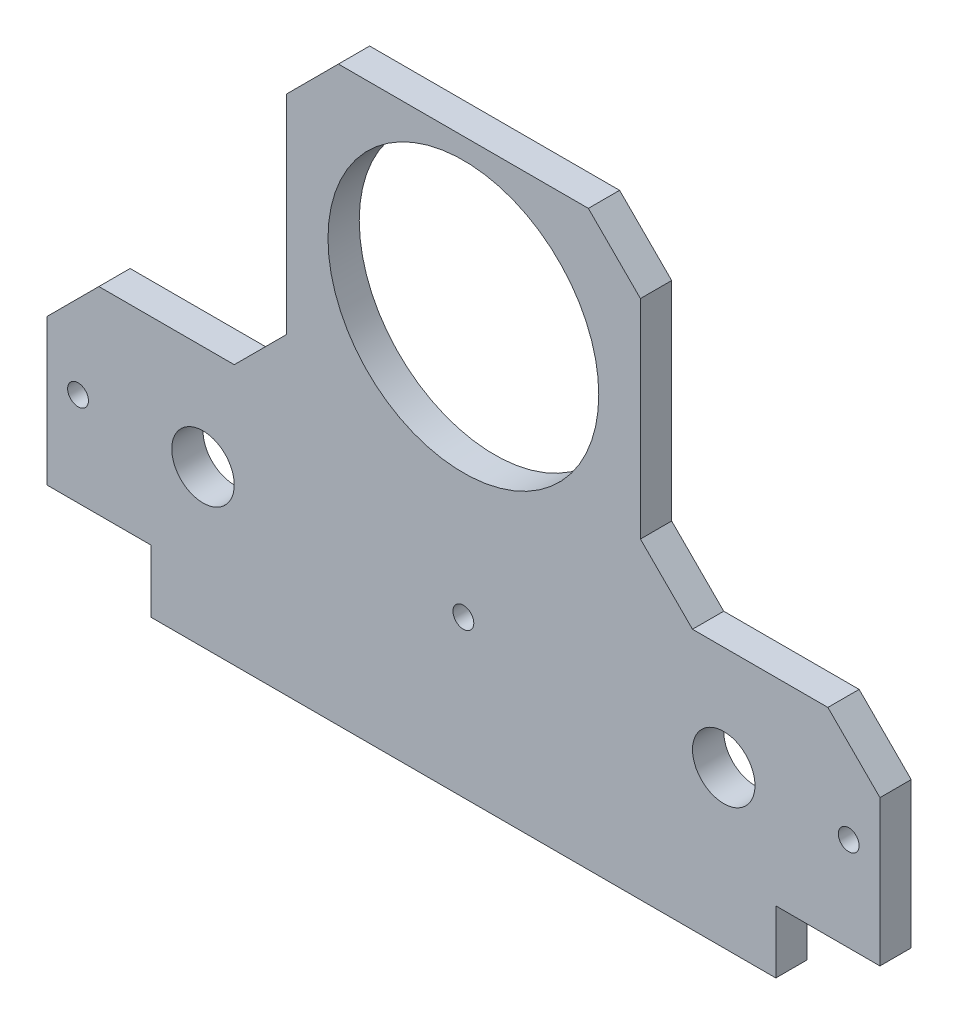
ISO-10303-21;
HEADER;
FILE_DESCRIPTION(('STEP AP214'),'2;1');
FILE_NAME('part.step','',(''),(''),'','','');
FILE_SCHEMA(('AUTOMOTIVE_DESIGN { 1 0 10303 214 1 1 1 1 }'));
ENDSEC;
DATA;
#1=APPLICATION_CONTEXT('core data for automotive mechanical design processes');
#2=APPLICATION_PROTOCOL_DEFINITION('international standard','automotive_design',2000,#1);
#3=PRODUCT_CONTEXT('',#1,'mechanical');
#4=PRODUCT('Part','Part','',(#3));
#5=PRODUCT_RELATED_PRODUCT_CATEGORY('part','',(#4));
#6=PRODUCT_DEFINITION_FORMATION('','',#4);
#7=PRODUCT_DEFINITION_CONTEXT('part definition',#1,'design');
#8=PRODUCT_DEFINITION('design','',#6,#7);
#9=PRODUCT_DEFINITION_SHAPE('','',#8);
#10=(LENGTH_UNIT() NAMED_UNIT(*) SI_UNIT(.MILLI.,.METRE.));
#11=(NAMED_UNIT(*) PLANE_ANGLE_UNIT() SI_UNIT($,.RADIAN.));
#12=(NAMED_UNIT(*) SI_UNIT($,.STERADIAN.) SOLID_ANGLE_UNIT());
#13=UNCERTAINTY_MEASURE_WITH_UNIT(LENGTH_MEASURE(1.E-05),#10,'distance_accuracy_value','');
#14=(GEOMETRIC_REPRESENTATION_CONTEXT(3) GLOBAL_UNCERTAINTY_ASSIGNED_CONTEXT((#13)) GLOBAL_UNIT_ASSIGNED_CONTEXT((#10,
#11,#12)) REPRESENTATION_CONTEXT('',''));
#15=CARTESIAN_POINT('',(0.,0.,0.));
#16=DIRECTION('',(0.,0.,1.));
#17=DIRECTION('',(1.,0.,0.));
#18=AXIS2_PLACEMENT_3D('',#15,#16,#17);
#19=CARTESIAN_POINT('',(0.,0.,12.));
#20=DIRECTION('',(0.,0.,1.));
#21=DIRECTION('',(1.,0.,0.));
#22=AXIS2_PLACEMENT_3D('',#19,#20,#21);
#23=PLANE('',#22);
#24=CARTESIAN_POINT('',(0.,15.,12.));
#25=DIRECTION('',(0.,0.,-1.));
#26=DIRECTION('',(-1.,0.,0.));
#27=AXIS2_PLACEMENT_3D('',#24,#25,#26);
#28=CIRCLE('',#27,1.);
#29=CARTESIAN_POINT('',(-1.,15.,12.));
#30=VERTEX_POINT('',#29);
#31=EDGE_CURVE('E272',#30,#30,#28,.T.);
#32=ORIENTED_EDGE('',*,*,#31,.T.);
#33=EDGE_LOOP('',(#32));
#34=FACE_BOUND('',#33,.T.);
#35=CARTESIAN_POINT('',(-37.,15.,12.));
#36=DIRECTION('',(0.,0.,-1.));
#37=DIRECTION('',(1.,0.,0.));
#38=AXIS2_PLACEMENT_3D('',#35,#36,#37);
#39=CIRCLE('',#38,0.999999999999998);
#40=CARTESIAN_POINT('',(-36.,15.,12.));
#41=VERTEX_POINT('',#40);
#42=EDGE_CURVE('E275',#41,#41,#39,.T.);
#43=ORIENTED_EDGE('',*,*,#42,.T.);
#44=EDGE_LOOP('',(#43));
#45=FACE_BOUND('',#44,.T.);
#46=CARTESIAN_POINT('',(37.,15.,12.));
#47=DIRECTION('',(0.,0.,-1.));
#48=DIRECTION('',(-1.,0.,0.));
#49=AXIS2_PLACEMENT_3D('',#46,#47,#48);
#50=CIRCLE('',#49,0.999999999999998);
#51=CARTESIAN_POINT('',(36.,15.,12.));
#52=VERTEX_POINT('',#51);
#53=EDGE_CURVE('E278',#52,#52,#50,.T.);
#54=ORIENTED_EDGE('',*,*,#53,.T.);
#55=EDGE_LOOP('',(#54));
#56=FACE_BOUND('',#55,.T.);
#57=DIRECTION('',(0.,1.,0.));
#58=VECTOR('',#57,1.);
#59=CARTESIAN_POINT('',(17.,25.,12.));
#60=LINE('',#59,#58);
#61=CARTESIAN_POINT('',(17.,30.,12.));
#62=VERTEX_POINT('',#61);
#63=CARTESIAN_POINT('',(17.,50.,12.));
#64=VERTEX_POINT('',#63);
#65=EDGE_CURVE('E189',#62,#64,#60,.T.);
#66=ORIENTED_EDGE('',*,*,#65,.T.);
#67=DIRECTION('',(0.707106781186547,-0.707106781186549,0.));
#68=VECTOR('',#67,1.);
#69=CARTESIAN_POINT('',(33.5,33.4999999999999,12.));
#70=LINE('',#69,#68);
#71=CARTESIAN_POINT('',(12.,55.,12.));
#72=VERTEX_POINT('',#71);
#73=EDGE_CURVE('E201',#64,#72,#70,.F.);
#74=ORIENTED_EDGE('',*,*,#73,.T.);
#75=DIRECTION('',(-1.,0.,0.));
#76=VECTOR('',#75,1.);
#77=CARTESIAN_POINT('',(17.,55.,12.));
#78=LINE('',#77,#76);
#79=CARTESIAN_POINT('',(-12.,55.,12.));
#80=VERTEX_POINT('',#79);
#81=EDGE_CURVE('E185',#72,#80,#78,.T.);
#82=ORIENTED_EDGE('',*,*,#81,.T.);
#83=DIRECTION('',(0.707106781186548,0.707106781186548,0.));
#84=VECTOR('',#83,1.);
#85=CARTESIAN_POINT('',(-33.5,33.5,12.));
#86=LINE('',#85,#84);
#87=CARTESIAN_POINT('',(-17.,50.,12.));
#88=VERTEX_POINT('',#87);
#89=EDGE_CURVE('E184',#80,#88,#86,.F.);
#90=ORIENTED_EDGE('',*,*,#89,.T.);
#91=DIRECTION('',(0.,-1.,0.));
#92=VECTOR('',#91,1.);
#93=CARTESIAN_POINT('',(-17.,25.,12.));
#94=LINE('',#93,#92);
#95=CARTESIAN_POINT('',(-17.,30.,12.));
#96=VERTEX_POINT('',#95);
#97=EDGE_CURVE('E314',#88,#96,#94,.T.);
#98=ORIENTED_EDGE('',*,*,#97,.T.);
#99=DIRECTION('',(0.707106781186551,0.707106781186544,0.));
#100=VECTOR('',#99,1.);
#101=CARTESIAN_POINT('',(-22.,25.,12.));
#102=LINE('',#101,#100);
#103=CARTESIAN_POINT('',(-22.,25.,12.));
#104=VERTEX_POINT('',#103);
#105=EDGE_CURVE('E11',#96,#104,#102,.F.);
#106=ORIENTED_EDGE('',*,*,#105,.T.);
#107=DIRECTION('',(-1.,0.,0.));
#108=VECTOR('',#107,1.);
#109=CARTESIAN_POINT('',(-40.,25.,12.));
#110=LINE('',#109,#108);
#111=CARTESIAN_POINT('',(-35.,25.,12.));
#112=VERTEX_POINT('',#111);
#113=EDGE_CURVE('E317',#104,#112,#110,.T.);
#114=ORIENTED_EDGE('',*,*,#113,.T.);
#115=DIRECTION('',(0.707106781186549,0.707106781186546,0.));
#116=VECTOR('',#115,1.);
#117=CARTESIAN_POINT('',(-29.9999999999999,30.0000000000001,12.));
#118=LINE('',#117,#116);
#119=CARTESIAN_POINT('',(-40.,20.,12.));
#120=VERTEX_POINT('',#119);
#121=EDGE_CURVE('E57',#112,#120,#118,.F.);
#122=ORIENTED_EDGE('',*,*,#121,.T.);
#123=DIRECTION('',(0.,-1.,0.));
#124=VECTOR('',#123,1.);
#125=CARTESIAN_POINT('',(-40.,0.,12.));
#126=LINE('',#125,#124);
#127=CARTESIAN_POINT('',(-40.,6.,12.));
#128=VERTEX_POINT('',#127);
#129=EDGE_CURVE('E319',#120,#128,#126,.T.);
#130=ORIENTED_EDGE('',*,*,#129,.T.);
#131=DIRECTION('',(-1.,0.,0.));
#132=VECTOR('',#131,1.);
#133=CARTESIAN_POINT('',(-40.,6.,12.));
#134=LINE('',#133,#132);
#135=CARTESIAN_POINT('',(-30.,6.,12.));
#136=VERTEX_POINT('',#135);
#137=EDGE_CURVE('E296',#136,#128,#134,.T.);
#138=ORIENTED_EDGE('',*,*,#137,.F.);
#139=DIRECTION('',(0.,1.,0.));
#140=VECTOR('',#139,1.);
#141=CARTESIAN_POINT('',(-30.,0.,12.));
#142=LINE('',#141,#140);
#143=CARTESIAN_POINT('',(-30.,0.,12.));
#144=VERTEX_POINT('',#143);
#145=EDGE_CURVE('E290',#144,#136,#142,.T.);
#146=ORIENTED_EDGE('',*,*,#145,.F.);
#147=DIRECTION('',(1.,0.,0.));
#148=VECTOR('',#147,1.);
#149=CARTESIAN_POINT('',(-40.,0.,12.));
#150=LINE('',#149,#148);
#151=CARTESIAN_POINT('',(30.,0.,12.));
#152=VERTEX_POINT('',#151);
#153=EDGE_CURVE('E321',#144,#152,#150,.T.);
#154=ORIENTED_EDGE('',*,*,#153,.T.);
#155=DIRECTION('',(0.,-1.,0.));
#156=VECTOR('',#155,1.);
#157=CARTESIAN_POINT('',(30.,0.,12.));
#158=LINE('',#157,#156);
#159=CARTESIAN_POINT('',(30.,6.,12.));
#160=VERTEX_POINT('',#159);
#161=EDGE_CURVE('E284',#160,#152,#158,.T.);
#162=ORIENTED_EDGE('',*,*,#161,.F.);
#163=DIRECTION('',(-1.,0.,0.));
#164=VECTOR('',#163,1.);
#165=CARTESIAN_POINT('',(40.,6.,12.));
#166=LINE('',#165,#164);
#167=CARTESIAN_POINT('',(40.,6.,12.));
#168=VERTEX_POINT('',#167);
#169=EDGE_CURVE('E281',#168,#160,#166,.T.);
#170=ORIENTED_EDGE('',*,*,#169,.F.);
#171=DIRECTION('',(0.,1.,0.));
#172=VECTOR('',#171,1.);
#173=CARTESIAN_POINT('',(40.,0.,12.));
#174=LINE('',#173,#172);
#175=CARTESIAN_POINT('',(40.,20.,12.));
#176=VERTEX_POINT('',#175);
#177=EDGE_CURVE('E324',#168,#176,#174,.T.);
#178=ORIENTED_EDGE('',*,*,#177,.T.);
#179=DIRECTION('',(0.707106781186546,-0.70710678118655,0.));
#180=VECTOR('',#179,1.);
#181=CARTESIAN_POINT('',(30.0000000000001,29.9999999999999,12.));
#182=LINE('',#181,#180);
#183=CARTESIAN_POINT('',(35.,25.,12.));
#184=VERTEX_POINT('',#183);
#185=EDGE_CURVE('E198',#176,#184,#182,.F.);
#186=ORIENTED_EDGE('',*,*,#185,.T.);
#187=DIRECTION('',(-1.,0.,0.));
#188=VECTOR('',#187,1.);
#189=CARTESIAN_POINT('',(40.,25.,12.));
#190=LINE('',#189,#188);
#191=CARTESIAN_POINT('',(22.,25.,12.));
#192=VERTEX_POINT('',#191);
#193=EDGE_CURVE('E229',#184,#192,#190,.T.);
#194=ORIENTED_EDGE('',*,*,#193,.T.);
#195=DIRECTION('',(0.707106781186544,-0.707106781186551,0.));
#196=VECTOR('',#195,1.);
#197=CARTESIAN_POINT('',(17.,30.,12.));
#198=LINE('',#197,#196);
#199=EDGE_CURVE('E42',#192,#62,#198,.F.);
#200=ORIENTED_EDGE('',*,*,#199,.T.);
#201=EDGE_LOOP('',(#66,#74,#82,#90,#98,#106,#114,#122,#130,#138,#146,#154,#162,#170,#178,#186,
#194,#200));
#202=FACE_BOUND('',#201,.T.);
#203=CARTESIAN_POINT('',(-25.,15.,12.));
#204=DIRECTION('',(0.,0.,-1.));
#205=DIRECTION('',(1.,0.,0.));
#206=AXIS2_PLACEMENT_3D('',#203,#204,#205);
#207=CIRCLE('',#206,3.);
#208=CARTESIAN_POINT('',(-22.,15.,12.));
#209=VERTEX_POINT('',#208);
#210=EDGE_CURVE('E302',#209,#209,#207,.T.);
#211=ORIENTED_EDGE('',*,*,#210,.T.);
#212=EDGE_LOOP('',(#211));
#213=FACE_BOUND('',#212,.T.);
#214=CARTESIAN_POINT('',(25.,15.,12.));
#215=DIRECTION('',(0.,0.,-1.));
#216=DIRECTION('',(-1.,0.,0.));
#217=AXIS2_PLACEMENT_3D('',#214,#215,#216);
#218=CIRCLE('',#217,3.);
#219=CARTESIAN_POINT('',(22.,15.,12.));
#220=VERTEX_POINT('',#219);
#221=EDGE_CURVE('E308',#220,#220,#218,.T.);
#222=ORIENTED_EDGE('',*,*,#221,.T.);
#223=EDGE_LOOP('',(#222));
#224=FACE_BOUND('',#223,.T.);
#225=CARTESIAN_POINT('',(0.,40.,12.));
#226=DIRECTION('',(0.,0.,1.));
#227=DIRECTION('',(1.,0.,0.));
#228=AXIS2_PLACEMENT_3D('',#225,#226,#227);
#229=CIRCLE('',#228,13.);
#230=CARTESIAN_POINT('',(13.,40.,12.));
#231=VERTEX_POINT('',#230);
#232=EDGE_CURVE('E311',#231,#231,#229,.T.);
#233=ORIENTED_EDGE('',*,*,#232,.F.);
#234=EDGE_LOOP('',(#233));
#235=FACE_BOUND('',#234,.T.);
#236=ADVANCED_FACE('F33',(#34,#45,#56,#202,#213,#224,#235),#23,.T.);
#237=CARTESIAN_POINT('',(-17.,25.,12.));
#238=DIRECTION('',(1.,0.,0.));
#239=DIRECTION('',(0.,1.,0.));
#240=AXIS2_PLACEMENT_3D('',#237,#238,#239);
#241=PLANE('',#240);
#242=DIRECTION('',(0.,0.,-1.));
#243=VECTOR('',#242,1.);
#244=CARTESIAN_POINT('',(-17.,50.,12.));
#245=LINE('',#244,#243);
#246=CARTESIAN_POINT('',(-17.,50.,9.));
#247=VERTEX_POINT('',#246);
#248=EDGE_CURVE('E205',#88,#247,#245,.T.);
#249=ORIENTED_EDGE('',*,*,#248,.T.);
#250=DIRECTION('',(0.,-1.,0.));
#251=VECTOR('',#250,1.);
#252=CARTESIAN_POINT('',(-17.,25.,9.));
#253=LINE('',#252,#251);
#254=CARTESIAN_POINT('',(-17.,30.,9.));
#255=VERTEX_POINT('',#254);
#256=EDGE_CURVE('E165',#247,#255,#253,.T.);
#257=ORIENTED_EDGE('',*,*,#256,.T.);
#258=DIRECTION('',(0.,0.,1.));
#259=VECTOR('',#258,1.);
#260=CARTESIAN_POINT('',(-17.,30.,12.));
#261=LINE('',#260,#259);
#262=EDGE_CURVE('E203',#255,#96,#261,.T.);
#263=ORIENTED_EDGE('',*,*,#262,.T.);
#264=ORIENTED_EDGE('',*,*,#97,.F.);
#265=EDGE_LOOP('',(#249,#257,#263,#264));
#266=FACE_BOUND('',#265,.T.);
#267=ADVANCED_FACE('F363',(#266),#241,.F.);
#268=CARTESIAN_POINT('',(-40.,25.,12.));
#269=DIRECTION('',(0.,-1.,0.));
#270=DIRECTION('',(1.,0.,0.));
#271=AXIS2_PLACEMENT_3D('',#268,#269,#270);
#272=PLANE('',#271);
#273=DIRECTION('',(0.,0.,-1.));
#274=VECTOR('',#273,1.);
#275=CARTESIAN_POINT('',(-22.,25.,0.));
#276=LINE('',#275,#274);
#277=CARTESIAN_POINT('',(-22.,25.,9.));
#278=VERTEX_POINT('',#277);
#279=EDGE_CURVE('E216',#104,#278,#276,.T.);
#280=ORIENTED_EDGE('',*,*,#279,.T.);
#281=DIRECTION('',(-1.,0.,0.));
#282=VECTOR('',#281,1.);
#283=CARTESIAN_POINT('',(-40.,25.,9.));
#284=LINE('',#283,#282);
#285=CARTESIAN_POINT('',(-35.,25.,9.));
#286=VERTEX_POINT('',#285);
#287=EDGE_CURVE('E356',#278,#286,#284,.T.);
#288=ORIENTED_EDGE('',*,*,#287,.T.);
#289=DIRECTION('',(0.,0.,1.));
#290=VECTOR('',#289,1.);
#291=CARTESIAN_POINT('',(-35.,25.,12.));
#292=LINE('',#291,#290);
#293=EDGE_CURVE('E214',#286,#112,#292,.T.);
#294=ORIENTED_EDGE('',*,*,#293,.T.);
#295=ORIENTED_EDGE('',*,*,#113,.F.);
#296=EDGE_LOOP('',(#280,#288,#294,#295));
#297=FACE_BOUND('',#296,.T.);
#298=ADVANCED_FACE('F371',(#297),#272,.F.);
#299=CARTESIAN_POINT('',(-40.,0.,12.));
#300=DIRECTION('',(1.,0.,0.));
#301=DIRECTION('',(0.,0.,-1.));
#302=AXIS2_PLACEMENT_3D('',#299,#300,#301);
#303=PLANE('',#302);
#304=DIRECTION('',(0.,0.,-1.));
#305=VECTOR('',#304,1.);
#306=CARTESIAN_POINT('',(-40.,20.,12.));
#307=LINE('',#306,#305);
#308=CARTESIAN_POINT('',(-40.,20.,9.));
#309=VERTEX_POINT('',#308);
#310=EDGE_CURVE('E219',#120,#309,#307,.T.);
#311=ORIENTED_EDGE('',*,*,#310,.T.);
#312=DIRECTION('',(0.,1.,0.));
#313=VECTOR('',#312,1.);
#314=CARTESIAN_POINT('',(-40.,0.,9.));
#315=LINE('',#314,#313);
#316=CARTESIAN_POINT('',(-40.,6.,9.));
#317=VERTEX_POINT('',#316);
#318=EDGE_CURVE('E49',#317,#309,#315,.T.);
#319=ORIENTED_EDGE('',*,*,#318,.F.);
#320=DIRECTION('',(0.,0.,1.));
#321=VECTOR('',#320,1.);
#322=CARTESIAN_POINT('',(-40.,6.,0.));
#323=LINE('',#322,#321);
#324=EDGE_CURVE('E300',#317,#128,#323,.T.);
#325=ORIENTED_EDGE('',*,*,#324,.T.);
#326=ORIENTED_EDGE('',*,*,#129,.F.);
#327=EDGE_LOOP('',(#311,#319,#325,#326));
#328=FACE_BOUND('',#327,.T.);
#329=ADVANCED_FACE('F376',(#328),#303,.F.);
#330=CARTESIAN_POINT('',(-40.,0.,12.));
#331=DIRECTION('',(0.,1.,0.));
#332=DIRECTION('',(0.,0.,1.));
#333=AXIS2_PLACEMENT_3D('',#330,#331,#332);
#334=PLANE('',#333);
#335=DIRECTION('',(0.,0.,1.));
#336=VECTOR('',#335,1.);
#337=CARTESIAN_POINT('',(-30.,0.,0.));
#338=LINE('',#337,#336);
#339=CARTESIAN_POINT('',(-30.,0.,9.));
#340=VERTEX_POINT('',#339);
#341=EDGE_CURVE('E299',#340,#144,#338,.T.);
#342=ORIENTED_EDGE('',*,*,#341,.F.);
#343=DIRECTION('',(1.,0.,0.));
#344=VECTOR('',#343,1.);
#345=CARTESIAN_POINT('',(-40.,0.,9.));
#346=LINE('',#345,#344);
#347=CARTESIAN_POINT('',(30.,0.,9.));
#348=VERTEX_POINT('',#347);
#349=EDGE_CURVE('E180',#340,#348,#346,.T.);
#350=ORIENTED_EDGE('',*,*,#349,.T.);
#351=DIRECTION('',(0.,0.,1.));
#352=VECTOR('',#351,1.);
#353=CARTESIAN_POINT('',(30.,0.,0.));
#354=LINE('',#353,#352);
#355=EDGE_CURVE('E288',#348,#152,#354,.T.);
#356=ORIENTED_EDGE('',*,*,#355,.T.);
#357=ORIENTED_EDGE('',*,*,#153,.F.);
#358=EDGE_LOOP('',(#342,#350,#356,#357));
#359=FACE_BOUND('',#358,.T.);
#360=ADVANCED_FACE('F388',(#359),#334,.F.);
#361=CARTESIAN_POINT('',(40.,0.,12.));
#362=DIRECTION('',(-1.,0.,0.));
#363=DIRECTION('',(0.,0.,1.));
#364=AXIS2_PLACEMENT_3D('',#361,#362,#363);
#365=PLANE('',#364);
#366=DIRECTION('',(0.,0.,1.));
#367=VECTOR('',#366,1.);
#368=CARTESIAN_POINT('',(40.,6.,0.));
#369=LINE('',#368,#367);
#370=CARTESIAN_POINT('',(40.,6.,9.));
#371=VERTEX_POINT('',#370);
#372=EDGE_CURVE('E287',#371,#168,#369,.T.);
#373=ORIENTED_EDGE('',*,*,#372,.F.);
#374=DIRECTION('',(0.,1.,0.));
#375=VECTOR('',#374,1.);
#376=CARTESIAN_POINT('',(40.,0.,9.));
#377=LINE('',#376,#375);
#378=CARTESIAN_POINT('',(40.,20.,9.));
#379=VERTEX_POINT('',#378);
#380=EDGE_CURVE('E341',#371,#379,#377,.T.);
#381=ORIENTED_EDGE('',*,*,#380,.T.);
#382=DIRECTION('',(0.,0.,1.));
#383=VECTOR('',#382,1.);
#384=CARTESIAN_POINT('',(40.,20.,12.));
#385=LINE('',#384,#383);
#386=EDGE_CURVE('E212',#379,#176,#385,.T.);
#387=ORIENTED_EDGE('',*,*,#386,.T.);
#388=ORIENTED_EDGE('',*,*,#177,.F.);
#389=EDGE_LOOP('',(#373,#381,#387,#388));
#390=FACE_BOUND('',#389,.T.);
#391=ADVANCED_FACE('F342',(#390),#365,.F.);
#392=CARTESIAN_POINT('',(40.,25.,12.));
#393=DIRECTION('',(0.,-1.,0.));
#394=DIRECTION('',(1.,0.,0.));
#395=AXIS2_PLACEMENT_3D('',#392,#393,#394);
#396=PLANE('',#395);
#397=DIRECTION('',(0.,0.,-1.));
#398=VECTOR('',#397,1.);
#399=CARTESIAN_POINT('',(35.,25.,12.));
#400=LINE('',#399,#398);
#401=CARTESIAN_POINT('',(35.,25.,9.));
#402=VERTEX_POINT('',#401);
#403=EDGE_CURVE('E209',#184,#402,#400,.T.);
#404=ORIENTED_EDGE('',*,*,#403,.T.);
#405=DIRECTION('',(-1.,0.,0.));
#406=VECTOR('',#405,1.);
#407=CARTESIAN_POINT('',(40.,25.,9.));
#408=LINE('',#407,#406);
#409=CARTESIAN_POINT('',(22.,25.,9.));
#410=VERTEX_POINT('',#409);
#411=EDGE_CURVE('E242',#402,#410,#408,.T.);
#412=ORIENTED_EDGE('',*,*,#411,.T.);
#413=DIRECTION('',(0.,0.,1.));
#414=VECTOR('',#413,1.);
#415=CARTESIAN_POINT('',(22.,25.,12.));
#416=LINE('',#415,#414);
#417=EDGE_CURVE('E207',#410,#192,#416,.T.);
#418=ORIENTED_EDGE('',*,*,#417,.T.);
#419=ORIENTED_EDGE('',*,*,#193,.F.);
#420=EDGE_LOOP('',(#404,#412,#418,#419));
#421=FACE_BOUND('',#420,.T.);
#422=ADVANCED_FACE('F339',(#421),#396,.F.);
#423=CARTESIAN_POINT('',(17.,25.,12.));
#424=DIRECTION('',(-1.,0.,0.));
#425=DIRECTION('',(0.,-1.,0.));
#426=AXIS2_PLACEMENT_3D('',#423,#424,#425);
#427=PLANE('',#426);
#428=DIRECTION('',(0.,0.,-1.));
#429=VECTOR('',#428,1.);
#430=CARTESIAN_POINT('',(17.,30.,0.));
#431=LINE('',#430,#429);
#432=CARTESIAN_POINT('',(17.,30.,9.));
#433=VERTEX_POINT('',#432);
#434=EDGE_CURVE('E187',#62,#433,#431,.T.);
#435=ORIENTED_EDGE('',*,*,#434,.T.);
#436=DIRECTION('',(0.,1.,0.));
#437=VECTOR('',#436,1.);
#438=CARTESIAN_POINT('',(17.,25.,9.));
#439=LINE('',#438,#437);
#440=CARTESIAN_POINT('',(17.,50.,9.));
#441=VERTEX_POINT('',#440);
#442=EDGE_CURVE('E240',#433,#441,#439,.T.);
#443=ORIENTED_EDGE('',*,*,#442,.T.);
#444=DIRECTION('',(0.,0.,1.));
#445=VECTOR('',#444,1.);
#446=CARTESIAN_POINT('',(17.,50.,12.));
#447=LINE('',#446,#445);
#448=EDGE_CURVE('E195',#441,#64,#447,.T.);
#449=ORIENTED_EDGE('',*,*,#448,.T.);
#450=ORIENTED_EDGE('',*,*,#65,.F.);
#451=EDGE_LOOP('',(#435,#443,#449,#450));
#452=FACE_BOUND('',#451,.T.);
#453=ADVANCED_FACE('F234',(#452),#427,.F.);
#454=CARTESIAN_POINT('',(17.,55.,12.));
#455=DIRECTION('',(0.,-1.,0.));
#456=DIRECTION('',(1.,0.,0.));
#457=AXIS2_PLACEMENT_3D('',#454,#455,#456);
#458=PLANE('',#457);
#459=DIRECTION('',(0.,0.,-1.));
#460=VECTOR('',#459,1.);
#461=CARTESIAN_POINT('',(12.,55.,12.));
#462=LINE('',#461,#460);
#463=CARTESIAN_POINT('',(12.,55.,9.));
#464=VERTEX_POINT('',#463);
#465=EDGE_CURVE('E179',#72,#464,#462,.T.);
#466=ORIENTED_EDGE('',*,*,#465,.T.);
#467=DIRECTION('',(1.,0.,0.));
#468=VECTOR('',#467,1.);
#469=CARTESIAN_POINT('',(-40.,55.,9.));
#470=LINE('',#469,#468);
#471=CARTESIAN_POINT('',(-12.,55.,9.));
#472=VERTEX_POINT('',#471);
#473=EDGE_CURVE('E162',#472,#464,#470,.T.);
#474=ORIENTED_EDGE('',*,*,#473,.F.);
#475=DIRECTION('',(0.,0.,1.));
#476=VECTOR('',#475,1.);
#477=CARTESIAN_POINT('',(-12.,55.,12.));
#478=LINE('',#477,#476);
#479=EDGE_CURVE('E176',#472,#80,#478,.T.);
#480=ORIENTED_EDGE('',*,*,#479,.T.);
#481=ORIENTED_EDGE('',*,*,#81,.F.);
#482=EDGE_LOOP('',(#466,#474,#480,#481));
#483=FACE_BOUND('',#482,.T.);
#484=ADVANCED_FACE('F174',(#483),#458,.F.);
#485=CARTESIAN_POINT('',(0.,40.,12.));
#486=DIRECTION('',(0.,0.,-1.));
#487=DIRECTION('',(-1.,0.,0.));
#488=AXIS2_PLACEMENT_3D('',#485,#486,#487);
#489=CYLINDRICAL_SURFACE('',#488,13.);
#490=CARTESIAN_POINT('',(0.,40.,9.));
#491=DIRECTION('',(0.,0.,1.));
#492=DIRECTION('',(1.,0.,0.));
#493=AXIS2_PLACEMENT_3D('',#490,#491,#492);
#494=CIRCLE('',#493,13.);
#495=CARTESIAN_POINT('',(13.,40.,9.));
#496=VERTEX_POINT('',#495);
#497=EDGE_CURVE('E269',#496,#496,#494,.T.);
#498=ORIENTED_EDGE('',*,*,#497,.F.);
#499=EDGE_LOOP('',(#498));
#500=FACE_BOUND('',#499,.T.);
#501=ORIENTED_EDGE('',*,*,#232,.T.);
#502=EDGE_LOOP('',(#501));
#503=FACE_BOUND('',#502,.T.);
#504=ADVANCED_FACE('F418',(#500,#503),#489,.F.);
#505=CARTESIAN_POINT('',(25.,15.,12.));
#506=DIRECTION('',(0.,0.,-1.));
#507=DIRECTION('',(-1.,0.,0.));
#508=AXIS2_PLACEMENT_3D('',#505,#506,#507);
#509=CYLINDRICAL_SURFACE('',#508,3.);
#510=CARTESIAN_POINT('',(25.,15.,9.));
#511=DIRECTION('',(0.,0.,1.));
#512=DIRECTION('',(1.,0.,0.));
#513=AXIS2_PLACEMENT_3D('',#510,#511,#512);
#514=CIRCLE('',#513,3.);
#515=CARTESIAN_POINT('',(28.,15.,9.));
#516=VERTEX_POINT('',#515);
#517=EDGE_CURVE('E266',#516,#516,#514,.F.);
#518=ORIENTED_EDGE('',*,*,#517,.T.);
#519=EDGE_LOOP('',(#518));
#520=FACE_BOUND('',#519,.T.);
#521=ORIENTED_EDGE('',*,*,#221,.F.);
#522=EDGE_LOOP('',(#521));
#523=FACE_BOUND('',#522,.T.);
#524=ADVANCED_FACE('F485',(#520,#523),#509,.F.);
#525=CARTESIAN_POINT('',(-25.,15.,12.));
#526=DIRECTION('',(0.,0.,-1.));
#527=DIRECTION('',(-1.,0.,0.));
#528=AXIS2_PLACEMENT_3D('',#525,#526,#527);
#529=CYLINDRICAL_SURFACE('',#528,3.);
#530=CARTESIAN_POINT('',(-25.,15.,9.));
#531=DIRECTION('',(0.,0.,1.));
#532=DIRECTION('',(1.,0.,0.));
#533=AXIS2_PLACEMENT_3D('',#530,#531,#532);
#534=CIRCLE('',#533,3.);
#535=CARTESIAN_POINT('',(-22.,15.,9.));
#536=VERTEX_POINT('',#535);
#537=EDGE_CURVE('E263',#536,#536,#534,.F.);
#538=ORIENTED_EDGE('',*,*,#537,.T.);
#539=EDGE_LOOP('',(#538));
#540=FACE_BOUND('',#539,.T.);
#541=ORIENTED_EDGE('',*,*,#210,.F.);
#542=EDGE_LOOP('',(#541));
#543=FACE_BOUND('',#542,.T.);
#544=ADVANCED_FACE('F482',(#540,#543),#529,.F.);
#545=CARTESIAN_POINT('',(-40.,6.,0.));
#546=DIRECTION('',(0.,1.,0.));
#547=DIRECTION('',(0.,0.,1.));
#548=AXIS2_PLACEMENT_3D('',#545,#546,#547);
#549=PLANE('',#548);
#550=ORIENTED_EDGE('',*,*,#324,.F.);
#551=DIRECTION('',(1.,0.,0.));
#552=VECTOR('',#551,1.);
#553=CARTESIAN_POINT('',(-40.,6.,9.));
#554=LINE('',#553,#552);
#555=CARTESIAN_POINT('',(-30.,6.,9.));
#556=VERTEX_POINT('',#555);
#557=EDGE_CURVE('E260',#317,#556,#554,.T.);
#558=ORIENTED_EDGE('',*,*,#557,.T.);
#559=DIRECTION('',(0.,0.,1.));
#560=VECTOR('',#559,1.);
#561=CARTESIAN_POINT('',(-30.,6.,0.));
#562=LINE('',#561,#560);
#563=EDGE_CURVE('E303',#556,#136,#562,.T.);
#564=ORIENTED_EDGE('',*,*,#563,.T.);
#565=ORIENTED_EDGE('',*,*,#137,.T.);
#566=EDGE_LOOP('',(#550,#558,#564,#565));
#567=FACE_BOUND('',#566,.T.);
#568=ADVANCED_FACE('F381',(#567),#549,.F.);
#569=CARTESIAN_POINT('',(-30.,0.,0.));
#570=DIRECTION('',(1.,0.,0.));
#571=DIRECTION('',(0.,0.,-1.));
#572=AXIS2_PLACEMENT_3D('',#569,#570,#571);
#573=PLANE('',#572);
#574=ORIENTED_EDGE('',*,*,#563,.F.);
#575=DIRECTION('',(0.,-1.,0.));
#576=VECTOR('',#575,1.);
#577=CARTESIAN_POINT('',(-30.,0.,9.));
#578=LINE('',#577,#576);
#579=EDGE_CURVE('E257',#556,#340,#578,.T.);
#580=ORIENTED_EDGE('',*,*,#579,.T.);
#581=ORIENTED_EDGE('',*,*,#341,.T.);
#582=ORIENTED_EDGE('',*,*,#145,.T.);
#583=EDGE_LOOP('',(#574,#580,#581,#582));
#584=FACE_BOUND('',#583,.T.);
#585=ADVANCED_FACE('F384',(#584),#573,.F.);
#586=CARTESIAN_POINT('',(30.,0.,0.));
#587=DIRECTION('',(-1.,0.,0.));
#588=DIRECTION('',(0.,0.,1.));
#589=AXIS2_PLACEMENT_3D('',#586,#587,#588);
#590=PLANE('',#589);
#591=ORIENTED_EDGE('',*,*,#355,.F.);
#592=DIRECTION('',(0.,1.,0.));
#593=VECTOR('',#592,1.);
#594=CARTESIAN_POINT('',(30.,0.,9.));
#595=LINE('',#594,#593);
#596=CARTESIAN_POINT('',(30.,6.,9.));
#597=VERTEX_POINT('',#596);
#598=EDGE_CURVE('E254',#348,#597,#595,.T.);
#599=ORIENTED_EDGE('',*,*,#598,.T.);
#600=DIRECTION('',(0.,0.,1.));
#601=VECTOR('',#600,1.);
#602=CARTESIAN_POINT('',(30.,6.,0.));
#603=LINE('',#602,#601);
#604=EDGE_CURVE('E291',#597,#160,#603,.T.);
#605=ORIENTED_EDGE('',*,*,#604,.T.);
#606=ORIENTED_EDGE('',*,*,#161,.T.);
#607=EDGE_LOOP('',(#591,#599,#605,#606));
#608=FACE_BOUND('',#607,.T.);
#609=ADVANCED_FACE('F392',(#608),#590,.F.);
#610=CARTESIAN_POINT('',(40.,6.,0.));
#611=DIRECTION('',(0.,1.,0.));
#612=DIRECTION('',(0.,0.,1.));
#613=AXIS2_PLACEMENT_3D('',#610,#611,#612);
#614=PLANE('',#613);
#615=ORIENTED_EDGE('',*,*,#604,.F.);
#616=DIRECTION('',(1.,0.,0.));
#617=VECTOR('',#616,1.);
#618=CARTESIAN_POINT('',(40.,6.,9.));
#619=LINE('',#618,#617);
#620=EDGE_CURVE('E251',#597,#371,#619,.T.);
#621=ORIENTED_EDGE('',*,*,#620,.T.);
#622=ORIENTED_EDGE('',*,*,#372,.T.);
#623=ORIENTED_EDGE('',*,*,#169,.T.);
#624=EDGE_LOOP('',(#615,#621,#622,#623));
#625=FACE_BOUND('',#624,.T.);
#626=ADVANCED_FACE('F395',(#625),#614,.F.);
#627=CARTESIAN_POINT('',(12.,55.,12.));
#628=DIRECTION('',(-0.707106781186549,-0.707106781186547,0.));
#629=DIRECTION('',(0.,0.,-1.));
#630=AXIS2_PLACEMENT_3D('',#627,#628,#629);
#631=PLANE('',#630);
#632=DIRECTION('',(-0.707106781186547,0.707106781186549,0.));
#633=VECTOR('',#632,1.);
#634=CARTESIAN_POINT('',(12.,55.,9.));
#635=LINE('',#634,#633);
#636=EDGE_CURVE('E249',#464,#441,#635,.F.);
#637=ORIENTED_EDGE('',*,*,#636,.F.);
#638=ORIENTED_EDGE('',*,*,#465,.F.);
#639=ORIENTED_EDGE('',*,*,#73,.F.);
#640=ORIENTED_EDGE('',*,*,#448,.F.);
#641=EDGE_LOOP('',(#637,#638,#639,#640));
#642=FACE_BOUND('',#641,.T.);
#643=ADVANCED_FACE('F397',(#642),#631,.F.);
#644=CARTESIAN_POINT('',(-17.,50.,12.));
#645=DIRECTION('',(0.707106781186547,-0.707106781186547,0.));
#646=DIRECTION('',(0.,0.,-1.));
#647=AXIS2_PLACEMENT_3D('',#644,#645,#646);
#648=PLANE('',#647);
#649=DIRECTION('',(-0.707106781186548,-0.707106781186548,0.));
#650=VECTOR('',#649,1.);
#651=CARTESIAN_POINT('',(-17.,50.,9.));
#652=LINE('',#651,#650);
#653=EDGE_CURVE('E158',#247,#472,#652,.F.);
#654=ORIENTED_EDGE('',*,*,#653,.F.);
#655=ORIENTED_EDGE('',*,*,#248,.F.);
#656=ORIENTED_EDGE('',*,*,#89,.F.);
#657=ORIENTED_EDGE('',*,*,#479,.F.);
#658=EDGE_LOOP('',(#654,#655,#656,#657));
#659=FACE_BOUND('',#658,.T.);
#660=ADVANCED_FACE('F183',(#659),#648,.F.);
#661=CARTESIAN_POINT('',(35.,25.,12.));
#662=DIRECTION('',(-0.707106781186549,-0.707106781186545,0.));
#663=DIRECTION('',(0.,0.,-1.));
#664=AXIS2_PLACEMENT_3D('',#661,#662,#663);
#665=PLANE('',#664);
#666=DIRECTION('',(-0.707106781186546,0.70710678118655,0.));
#667=VECTOR('',#666,1.);
#668=CARTESIAN_POINT('',(35.,25.,9.));
#669=LINE('',#668,#667);
#670=EDGE_CURVE('E247',#402,#379,#669,.F.);
#671=ORIENTED_EDGE('',*,*,#670,.F.);
#672=ORIENTED_EDGE('',*,*,#403,.F.);
#673=ORIENTED_EDGE('',*,*,#185,.F.);
#674=ORIENTED_EDGE('',*,*,#386,.F.);
#675=EDGE_LOOP('',(#671,#672,#673,#674));
#676=FACE_BOUND('',#675,.T.);
#677=ADVANCED_FACE('F337',(#676),#665,.F.);
#678=CARTESIAN_POINT('',(17.,30.,12.));
#679=DIRECTION('',(0.707106781186551,0.707106781186544,0.));
#680=DIRECTION('',(0.,0.,1.));
#681=AXIS2_PLACEMENT_3D('',#678,#679,#680);
#682=PLANE('',#681);
#683=ORIENTED_EDGE('',*,*,#417,.F.);
#684=DIRECTION('',(0.707106781186544,-0.707106781186551,0.));
#685=VECTOR('',#684,1.);
#686=CARTESIAN_POINT('',(17.,30.,9.));
#687=LINE('',#686,#685);
#688=EDGE_CURVE('E170',#410,#433,#687,.F.);
#689=ORIENTED_EDGE('',*,*,#688,.T.);
#690=ORIENTED_EDGE('',*,*,#434,.F.);
#691=ORIENTED_EDGE('',*,*,#199,.F.);
#692=EDGE_LOOP('',(#683,#689,#690,#691));
#693=FACE_BOUND('',#692,.T.);
#694=ADVANCED_FACE('F238',(#693),#682,.T.);
#695=CARTESIAN_POINT('',(-22.,25.,12.));
#696=DIRECTION('',(-0.707106781186544,0.707106781186551,0.));
#697=DIRECTION('',(0.,0.,1.));
#698=AXIS2_PLACEMENT_3D('',#695,#696,#697);
#699=PLANE('',#698);
#700=ORIENTED_EDGE('',*,*,#262,.F.);
#701=DIRECTION('',(0.707106781186551,0.707106781186544,0.));
#702=VECTOR('',#701,1.);
#703=CARTESIAN_POINT('',(-22.,25.,9.));
#704=LINE('',#703,#702);
#705=EDGE_CURVE('E359',#255,#278,#704,.F.);
#706=ORIENTED_EDGE('',*,*,#705,.T.);
#707=ORIENTED_EDGE('',*,*,#279,.F.);
#708=ORIENTED_EDGE('',*,*,#105,.F.);
#709=EDGE_LOOP('',(#700,#706,#707,#708));
#710=FACE_BOUND('',#709,.T.);
#711=ADVANCED_FACE('F367',(#710),#699,.T.);
#712=CARTESIAN_POINT('',(-40.,20.,12.));
#713=DIRECTION('',(0.707106781186545,-0.707106781186549,0.));
#714=DIRECTION('',(0.,0.,-1.));
#715=AXIS2_PLACEMENT_3D('',#712,#713,#714);
#716=PLANE('',#715);
#717=DIRECTION('',(-0.707106781186549,-0.707106781186546,0.));
#718=VECTOR('',#717,1.);
#719=CARTESIAN_POINT('',(-40.,20.,9.));
#720=LINE('',#719,#718);
#721=EDGE_CURVE('E354',#309,#286,#720,.F.);
#722=ORIENTED_EDGE('',*,*,#721,.F.);
#723=ORIENTED_EDGE('',*,*,#310,.F.);
#724=ORIENTED_EDGE('',*,*,#121,.F.);
#725=ORIENTED_EDGE('',*,*,#293,.F.);
#726=EDGE_LOOP('',(#722,#723,#724,#725));
#727=FACE_BOUND('',#726,.T.);
#728=ADVANCED_FACE('F35',(#727),#716,.F.);
#729=CARTESIAN_POINT('',(37.,15.,12.));
#730=DIRECTION('',(0.,0.,-1.));
#731=DIRECTION('',(-1.,0.,0.));
#732=AXIS2_PLACEMENT_3D('',#729,#730,#731);
#733=CYLINDRICAL_SURFACE('',#732,0.999999999999998);
#734=CARTESIAN_POINT('',(37.,15.,9.));
#735=DIRECTION('',(0.,0.,1.));
#736=DIRECTION('',(1.,0.,0.));
#737=AXIS2_PLACEMENT_3D('',#734,#735,#736);
#738=CIRCLE('',#737,0.999999999999998);
#739=CARTESIAN_POINT('',(38.,15.,9.));
#740=VERTEX_POINT('',#739);
#741=EDGE_CURVE('E351',#740,#740,#738,.F.);
#742=ORIENTED_EDGE('',*,*,#741,.T.);
#743=EDGE_LOOP('',(#742));
#744=FACE_BOUND('',#743,.T.);
#745=ORIENTED_EDGE('',*,*,#53,.F.);
#746=EDGE_LOOP('',(#745));
#747=FACE_BOUND('',#746,.T.);
#748=ADVANCED_FACE('F443',(#744,#747),#733,.F.);
#749=CARTESIAN_POINT('',(-37.,15.,12.));
#750=DIRECTION('',(0.,0.,-1.));
#751=DIRECTION('',(-1.,0.,0.));
#752=AXIS2_PLACEMENT_3D('',#749,#750,#751);
#753=CYLINDRICAL_SURFACE('',#752,0.999999999999998);
#754=CARTESIAN_POINT('',(-37.,15.,9.));
#755=DIRECTION('',(0.,0.,1.));
#756=DIRECTION('',(1.,0.,0.));
#757=AXIS2_PLACEMENT_3D('',#754,#755,#756);
#758=CIRCLE('',#757,0.999999999999998);
#759=CARTESIAN_POINT('',(-36.,15.,9.));
#760=VERTEX_POINT('',#759);
#761=EDGE_CURVE('E345',#760,#760,#758,.F.);
#762=ORIENTED_EDGE('',*,*,#761,.T.);
#763=EDGE_LOOP('',(#762));
#764=FACE_BOUND('',#763,.T.);
#765=ORIENTED_EDGE('',*,*,#42,.F.);
#766=EDGE_LOOP('',(#765));
#767=FACE_BOUND('',#766,.T.);
#768=ADVANCED_FACE('F447',(#764,#767),#753,.F.);
#769=CARTESIAN_POINT('',(0.,15.,12.));
#770=DIRECTION('',(0.,0.,-1.));
#771=DIRECTION('',(-1.,0.,0.));
#772=AXIS2_PLACEMENT_3D('',#769,#770,#771);
#773=CYLINDRICAL_SURFACE('',#772,1.);
#774=CARTESIAN_POINT('',(0.,15.,9.));
#775=DIRECTION('',(0.,0.,1.));
#776=DIRECTION('',(1.,0.,0.));
#777=AXIS2_PLACEMENT_3D('',#774,#775,#776);
#778=CIRCLE('',#777,1.);
#779=CARTESIAN_POINT('',(1.,15.,9.));
#780=VERTEX_POINT('',#779);
#781=EDGE_CURVE('E37',#780,#780,#778,.F.);
#782=ORIENTED_EDGE('',*,*,#781,.T.);
#783=EDGE_LOOP('',(#782));
#784=FACE_BOUND('',#783,.T.);
#785=ORIENTED_EDGE('',*,*,#31,.F.);
#786=EDGE_LOOP('',(#785));
#787=FACE_BOUND('',#786,.T.);
#788=ADVANCED_FACE('F453',(#784,#787),#773,.F.);
#789=CARTESIAN_POINT('',(-40.,0.,9.));
#790=DIRECTION('',(0.,0.,1.));
#791=DIRECTION('',(1.,0.,0.));
#792=AXIS2_PLACEMENT_3D('',#789,#790,#791);
#793=PLANE('',#792);
#794=ORIENTED_EDGE('',*,*,#497,.T.);
#795=EDGE_LOOP('',(#794));
#796=FACE_BOUND('',#795,.T.);
#797=ORIENTED_EDGE('',*,*,#537,.F.);
#798=EDGE_LOOP('',(#797));
#799=FACE_BOUND('',#798,.T.);
#800=ORIENTED_EDGE('',*,*,#761,.F.);
#801=EDGE_LOOP('',(#800));
#802=FACE_BOUND('',#801,.T.);
#803=ORIENTED_EDGE('',*,*,#781,.F.);
#804=EDGE_LOOP('',(#803));
#805=FACE_BOUND('',#804,.T.);
#806=ORIENTED_EDGE('',*,*,#741,.F.);
#807=EDGE_LOOP('',(#806));
#808=FACE_BOUND('',#807,.T.);
#809=ORIENTED_EDGE('',*,*,#318,.T.);
#810=ORIENTED_EDGE('',*,*,#721,.T.);
#811=ORIENTED_EDGE('',*,*,#287,.F.);
#812=ORIENTED_EDGE('',*,*,#705,.F.);
#813=ORIENTED_EDGE('',*,*,#256,.F.);
#814=ORIENTED_EDGE('',*,*,#653,.T.);
#815=ORIENTED_EDGE('',*,*,#473,.T.);
#816=ORIENTED_EDGE('',*,*,#636,.T.);
#817=ORIENTED_EDGE('',*,*,#442,.F.);
#818=ORIENTED_EDGE('',*,*,#688,.F.);
#819=ORIENTED_EDGE('',*,*,#411,.F.);
#820=ORIENTED_EDGE('',*,*,#670,.T.);
#821=ORIENTED_EDGE('',*,*,#380,.F.);
#822=ORIENTED_EDGE('',*,*,#620,.F.);
#823=ORIENTED_EDGE('',*,*,#598,.F.);
#824=ORIENTED_EDGE('',*,*,#349,.F.);
#825=ORIENTED_EDGE('',*,*,#579,.F.);
#826=ORIENTED_EDGE('',*,*,#557,.F.);
#827=EDGE_LOOP('',(#809,#810,#811,#812,#813,#814,#815,#816,#817,#818,#819,#820,#821,#822,#823,
#824,#825,#826));
#828=FACE_BOUND('',#827,.T.);
#829=ORIENTED_EDGE('',*,*,#517,.F.);
#830=EDGE_LOOP('',(#829));
#831=FACE_BOUND('',#830,.T.);
#832=ADVANCED_FACE('F160',(#796,#799,#802,#805,#808,#828,#831),#793,.F.);
#833=CLOSED_SHELL('',(#236,#267,#298,#329,#360,#391,#422,#453,#484,#504,#524,#544,#568,#585,
#609,#626,#643,#660,#677,#694,#711,#728,#748,#768,#788,#832));
#834=MANIFOLD_SOLID_BREP('B2',#833);
#835=ADVANCED_BREP_SHAPE_REPRESENTATION('',(#18,#834),#14);
#836=SHAPE_DEFINITION_REPRESENTATION(#9,#835);
ENDSEC;
END-ISO-10303-21;
